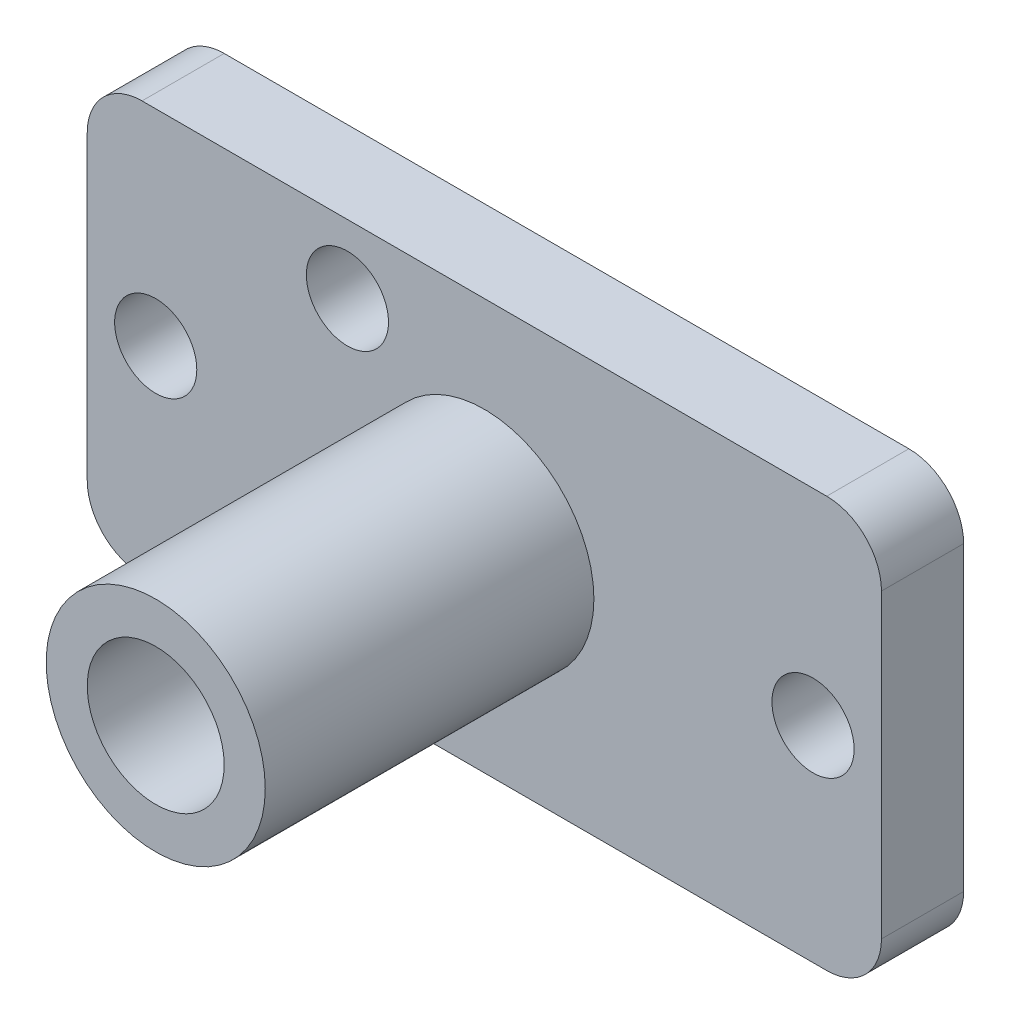
ISO-10303-21;
HEADER;
FILE_DESCRIPTION(('STEP AP214'),'2;1');
FILE_NAME('part.step','',(''),(''),'','','');
FILE_SCHEMA(('AUTOMOTIVE_DESIGN { 1 0 10303 214 1 1 1 1 }'));
ENDSEC;
DATA;
#1=APPLICATION_CONTEXT('core data for automotive mechanical design processes');
#2=APPLICATION_PROTOCOL_DEFINITION('international standard','automotive_design',2000,#1);
#3=PRODUCT_CONTEXT('',#1,'mechanical');
#4=PRODUCT('Part','Part','',(#3));
#5=PRODUCT_RELATED_PRODUCT_CATEGORY('part','',(#4));
#6=PRODUCT_DEFINITION_FORMATION('','',#4);
#7=PRODUCT_DEFINITION_CONTEXT('part definition',#1,'design');
#8=PRODUCT_DEFINITION('design','',#6,#7);
#9=PRODUCT_DEFINITION_SHAPE('','',#8);
#10=(LENGTH_UNIT() NAMED_UNIT(*) SI_UNIT(.MILLI.,.METRE.));
#11=(NAMED_UNIT(*) PLANE_ANGLE_UNIT() SI_UNIT($,.RADIAN.));
#12=(NAMED_UNIT(*) SI_UNIT($,.STERADIAN.) SOLID_ANGLE_UNIT());
#13=UNCERTAINTY_MEASURE_WITH_UNIT(LENGTH_MEASURE(1.E-05),#10,'distance_accuracy_value','');
#14=(GEOMETRIC_REPRESENTATION_CONTEXT(3) GLOBAL_UNCERTAINTY_ASSIGNED_CONTEXT((#13)) GLOBAL_UNIT_ASSIGNED_CONTEXT((#10,
#11,#12)) REPRESENTATION_CONTEXT('',''));
#15=CARTESIAN_POINT('',(0.,0.,0.));
#16=DIRECTION('',(0.,0.,1.));
#17=DIRECTION('',(1.,0.,0.));
#18=AXIS2_PLACEMENT_3D('',#15,#16,#17);
#19=CARTESIAN_POINT('',(0.,0.,3.));
#20=DIRECTION('',(0.,1.,0.));
#21=DIRECTION('',(0.,0.,1.));
#22=AXIS2_PLACEMENT_3D('',#19,#20,#21);
#23=PLANE('',#22);
#24=DIRECTION('',(1.,0.,0.));
#25=VECTOR('',#24,1.);
#26=CARTESIAN_POINT('',(0.,0.,0.));
#27=LINE('',#26,#25);
#28=CARTESIAN_POINT('',(2.,0.,0.));
#29=VERTEX_POINT('',#28);
#30=CARTESIAN_POINT('',(27.,0.,0.));
#31=VERTEX_POINT('',#30);
#32=EDGE_CURVE('E210',#29,#31,#27,.T.);
#33=ORIENTED_EDGE('',*,*,#32,.T.);
#34=DIRECTION('',(0.,0.,-1.));
#35=VECTOR('',#34,1.);
#36=CARTESIAN_POINT('',(27.,0.,3.));
#37=LINE('',#36,#35);
#38=CARTESIAN_POINT('',(27.,0.,3.));
#39=VERTEX_POINT('',#38);
#40=EDGE_CURVE('E180',#31,#39,#37,.F.);
#41=ORIENTED_EDGE('',*,*,#40,.T.);
#42=DIRECTION('',(1.,0.,0.));
#43=VECTOR('',#42,1.);
#44=CARTESIAN_POINT('',(0.,0.,3.));
#45=LINE('',#44,#43);
#46=CARTESIAN_POINT('',(2.,0.,3.));
#47=VERTEX_POINT('',#46);
#48=EDGE_CURVE('E230',#47,#39,#45,.T.);
#49=ORIENTED_EDGE('',*,*,#48,.F.);
#50=DIRECTION('',(0.,0.,-1.));
#51=VECTOR('',#50,1.);
#52=CARTESIAN_POINT('',(2.,0.,0.));
#53=LINE('',#52,#51);
#54=EDGE_CURVE('E176',#47,#29,#53,.T.);
#55=ORIENTED_EDGE('',*,*,#54,.T.);
#56=EDGE_LOOP('',(#33,#41,#49,#55));
#57=FACE_BOUND('',#56,.T.);
#58=ADVANCED_FACE('F51',(#57),#23,.F.);
#59=CARTESIAN_POINT('',(29.,0.,3.));
#60=DIRECTION('',(-1.,0.,0.));
#61=DIRECTION('',(0.,-1.,0.));
#62=AXIS2_PLACEMENT_3D('',#59,#60,#61);
#63=PLANE('',#62);
#64=DIRECTION('',(0.,1.,0.));
#65=VECTOR('',#64,1.);
#66=CARTESIAN_POINT('',(29.,0.,0.));
#67=LINE('',#66,#65);
#68=CARTESIAN_POINT('',(29.,2.,0.));
#69=VERTEX_POINT('',#68);
#70=CARTESIAN_POINT('',(29.,13.,0.));
#71=VERTEX_POINT('',#70);
#72=EDGE_CURVE('E137',#69,#71,#67,.T.);
#73=ORIENTED_EDGE('',*,*,#72,.T.);
#74=DIRECTION('',(0.,0.,-1.));
#75=VECTOR('',#74,1.);
#76=CARTESIAN_POINT('',(29.,13.,3.));
#77=LINE('',#76,#75);
#78=CARTESIAN_POINT('',(29.,13.,3.));
#79=VERTEX_POINT('',#78);
#80=EDGE_CURVE('E162',#71,#79,#77,.F.);
#81=ORIENTED_EDGE('',*,*,#80,.T.);
#82=DIRECTION('',(0.,1.,0.));
#83=VECTOR('',#82,1.);
#84=CARTESIAN_POINT('',(29.,0.,3.));
#85=LINE('',#84,#83);
#86=CARTESIAN_POINT('',(29.,2.,3.));
#87=VERTEX_POINT('',#86);
#88=EDGE_CURVE('E189',#87,#79,#85,.T.);
#89=ORIENTED_EDGE('',*,*,#88,.F.);
#90=DIRECTION('',(0.,0.,-1.));
#91=VECTOR('',#90,1.);
#92=CARTESIAN_POINT('',(29.,2.,3.));
#93=LINE('',#92,#91);
#94=EDGE_CURVE('E158',#87,#69,#93,.T.);
#95=ORIENTED_EDGE('',*,*,#94,.T.);
#96=EDGE_LOOP('',(#73,#81,#89,#95));
#97=FACE_BOUND('',#96,.T.);
#98=ADVANCED_FACE('F219',(#97),#63,.F.);
#99=CARTESIAN_POINT('',(0.,15.,3.));
#100=DIRECTION('',(0.,1.,0.));
#101=DIRECTION('',(0.,0.,1.));
#102=AXIS2_PLACEMENT_3D('',#99,#100,#101);
#103=PLANE('',#102);
#104=DIRECTION('',(1.,0.,0.));
#105=VECTOR('',#104,1.);
#106=CARTESIAN_POINT('',(0.,15.,3.));
#107=LINE('',#106,#105);
#108=CARTESIAN_POINT('',(2.,15.,3.));
#109=VERTEX_POINT('',#108);
#110=CARTESIAN_POINT('',(27.,15.,3.));
#111=VERTEX_POINT('',#110);
#112=EDGE_CURVE('E186',#109,#111,#107,.T.);
#113=ORIENTED_EDGE('',*,*,#112,.T.);
#114=DIRECTION('',(0.,0.,-1.));
#115=VECTOR('',#114,1.);
#116=CARTESIAN_POINT('',(27.,15.,0.));
#117=LINE('',#116,#115);
#118=CARTESIAN_POINT('',(27.,15.,0.));
#119=VERTEX_POINT('',#118);
#120=EDGE_CURVE('E128',#111,#119,#117,.T.);
#121=ORIENTED_EDGE('',*,*,#120,.T.);
#122=DIRECTION('',(1.,0.,0.));
#123=VECTOR('',#122,1.);
#124=CARTESIAN_POINT('',(0.,15.,0.));
#125=LINE('',#124,#123);
#126=CARTESIAN_POINT('',(2.,15.,0.));
#127=VERTEX_POINT('',#126);
#128=EDGE_CURVE('E120',#127,#119,#125,.T.);
#129=ORIENTED_EDGE('',*,*,#128,.F.);
#130=DIRECTION('',(0.,0.,-1.));
#131=VECTOR('',#130,1.);
#132=CARTESIAN_POINT('',(2.,15.,3.));
#133=LINE('',#132,#131);
#134=EDGE_CURVE('E134',#127,#109,#133,.F.);
#135=ORIENTED_EDGE('',*,*,#134,.T.);
#136=EDGE_LOOP('',(#113,#121,#129,#135));
#137=FACE_BOUND('',#136,.T.);
#138=ADVANCED_FACE('F133',(#137),#103,.T.);
#139=CARTESIAN_POINT('',(2.5,7.5,3.));
#140=DIRECTION('',(0.,0.,-1.));
#141=DIRECTION('',(-1.,0.,0.));
#142=AXIS2_PLACEMENT_3D('',#139,#140,#141);
#143=CYLINDRICAL_SURFACE('',#142,1.5);
#144=CARTESIAN_POINT('',(2.5,7.5,3.));
#145=DIRECTION('',(0.,0.,1.));
#146=DIRECTION('',(1.,0.,0.));
#147=AXIS2_PLACEMENT_3D('',#144,#145,#146);
#148=CIRCLE('',#147,1.5);
#149=CARTESIAN_POINT('',(4.,7.5,3.));
#150=VERTEX_POINT('',#149);
#151=EDGE_CURVE('E232',#150,#150,#148,.T.);
#152=ORIENTED_EDGE('',*,*,#151,.T.);
#153=EDGE_LOOP('',(#152));
#154=FACE_BOUND('',#153,.T.);
#155=CARTESIAN_POINT('',(2.5,7.5,0.));
#156=DIRECTION('',(0.,0.,1.));
#157=DIRECTION('',(1.,0.,0.));
#158=AXIS2_PLACEMENT_3D('',#155,#156,#157);
#159=CIRCLE('',#158,1.5);
#160=CARTESIAN_POINT('',(4.,7.5,0.));
#161=VERTEX_POINT('',#160);
#162=EDGE_CURVE('E206',#161,#161,#159,.T.);
#163=ORIENTED_EDGE('',*,*,#162,.F.);
#164=EDGE_LOOP('',(#163));
#165=FACE_BOUND('',#164,.T.);
#166=ADVANCED_FACE('F287',(#154,#165),#143,.F.);
#167=CARTESIAN_POINT('',(26.5,7.5,3.));
#168=DIRECTION('',(0.,0.,-1.));
#169=DIRECTION('',(-1.,0.,0.));
#170=AXIS2_PLACEMENT_3D('',#167,#168,#169);
#171=CYLINDRICAL_SURFACE('',#170,1.5);
#172=CARTESIAN_POINT('',(26.5,7.5,3.));
#173=DIRECTION('',(0.,0.,1.));
#174=DIRECTION('',(1.,0.,0.));
#175=AXIS2_PLACEMENT_3D('',#172,#173,#174);
#176=CIRCLE('',#175,1.5);
#177=CARTESIAN_POINT('',(28.,7.5,3.));
#178=VERTEX_POINT('',#177);
#179=EDGE_CURVE('E238',#178,#178,#176,.T.);
#180=ORIENTED_EDGE('',*,*,#179,.T.);
#181=EDGE_LOOP('',(#180));
#182=FACE_BOUND('',#181,.T.);
#183=CARTESIAN_POINT('',(26.5,7.5,0.));
#184=DIRECTION('',(0.,0.,1.));
#185=DIRECTION('',(1.,0.,0.));
#186=AXIS2_PLACEMENT_3D('',#183,#184,#185);
#187=CIRCLE('',#186,1.5);
#188=CARTESIAN_POINT('',(28.,7.5,0.));
#189=VERTEX_POINT('',#188);
#190=EDGE_CURVE('E202',#189,#189,#187,.T.);
#191=ORIENTED_EDGE('',*,*,#190,.F.);
#192=EDGE_LOOP('',(#191));
#193=FACE_BOUND('',#192,.T.);
#194=ADVANCED_FACE('F290',(#182,#193),#171,.F.);
#195=CARTESIAN_POINT('',(9.5,12.5,3.));
#196=DIRECTION('',(0.,0.,-1.));
#197=DIRECTION('',(-1.,0.,0.));
#198=AXIS2_PLACEMENT_3D('',#195,#196,#197);
#199=CYLINDRICAL_SURFACE('',#198,1.5);
#200=CARTESIAN_POINT('',(9.5,12.5,3.));
#201=DIRECTION('',(0.,0.,1.));
#202=DIRECTION('',(1.,0.,0.));
#203=AXIS2_PLACEMENT_3D('',#200,#201,#202);
#204=CIRCLE('',#203,1.5);
#205=CARTESIAN_POINT('',(11.,12.5,3.));
#206=VERTEX_POINT('',#205);
#207=EDGE_CURVE('E242',#206,#206,#204,.T.);
#208=ORIENTED_EDGE('',*,*,#207,.T.);
#209=EDGE_LOOP('',(#208));
#210=FACE_BOUND('',#209,.T.);
#211=CARTESIAN_POINT('',(9.5,12.5,0.));
#212=DIRECTION('',(0.,0.,1.));
#213=DIRECTION('',(1.,0.,0.));
#214=AXIS2_PLACEMENT_3D('',#211,#212,#213);
#215=CIRCLE('',#214,1.5);
#216=CARTESIAN_POINT('',(11.,12.5,0.));
#217=VERTEX_POINT('',#216);
#218=EDGE_CURVE('E197',#217,#217,#215,.T.);
#219=ORIENTED_EDGE('',*,*,#218,.F.);
#220=EDGE_LOOP('',(#219));
#221=FACE_BOUND('',#220,.T.);
#222=ADVANCED_FACE('F294',(#210,#221),#199,.F.);
#223=CARTESIAN_POINT('',(9.5,2.5,3.));
#224=DIRECTION('',(0.,0.,-1.));
#225=DIRECTION('',(-1.,0.,0.));
#226=AXIS2_PLACEMENT_3D('',#223,#224,#225);
#227=CYLINDRICAL_SURFACE('',#226,1.5);
#228=CARTESIAN_POINT('',(9.5,2.5,3.));
#229=DIRECTION('',(0.,0.,1.));
#230=DIRECTION('',(1.,0.,0.));
#231=AXIS2_PLACEMENT_3D('',#228,#229,#230);
#232=CIRCLE('',#231,1.5);
#233=CARTESIAN_POINT('',(11.,2.5,3.));
#234=VERTEX_POINT('',#233);
#235=EDGE_CURVE('E246',#234,#234,#232,.T.);
#236=ORIENTED_EDGE('',*,*,#235,.T.);
#237=EDGE_LOOP('',(#236));
#238=FACE_BOUND('',#237,.T.);
#239=CARTESIAN_POINT('',(9.5,2.5,0.));
#240=DIRECTION('',(0.,0.,1.));
#241=DIRECTION('',(1.,0.,0.));
#242=AXIS2_PLACEMENT_3D('',#239,#240,#241);
#243=CIRCLE('',#242,1.5);
#244=CARTESIAN_POINT('',(11.,2.5,0.));
#245=VERTEX_POINT('',#244);
#246=EDGE_CURVE('E193',#245,#245,#243,.T.);
#247=ORIENTED_EDGE('',*,*,#246,.F.);
#248=EDGE_LOOP('',(#247));
#249=FACE_BOUND('',#248,.T.);
#250=ADVANCED_FACE('F298',(#238,#249),#227,.F.);
#251=CARTESIAN_POINT('',(0.,0.,3.));
#252=DIRECTION('',(-1.,0.,0.));
#253=DIRECTION('',(0.,0.,1.));
#254=AXIS2_PLACEMENT_3D('',#251,#252,#253);
#255=PLANE('',#254);
#256=DIRECTION('',(0.,1.,0.));
#257=VECTOR('',#256,1.);
#258=CARTESIAN_POINT('',(0.,0.,0.));
#259=LINE('',#258,#257);
#260=CARTESIAN_POINT('',(0.,2.,0.));
#261=VERTEX_POINT('',#260);
#262=CARTESIAN_POINT('',(0.,13.,0.));
#263=VERTEX_POINT('',#262);
#264=EDGE_CURVE('E121',#261,#263,#259,.T.);
#265=ORIENTED_EDGE('',*,*,#264,.F.);
#266=DIRECTION('',(0.,0.,-1.));
#267=VECTOR('',#266,1.);
#268=CARTESIAN_POINT('',(0.,2.,3.));
#269=LINE('',#268,#267);
#270=CARTESIAN_POINT('',(0.,2.,3.));
#271=VERTEX_POINT('',#270);
#272=EDGE_CURVE('E12',#261,#271,#269,.F.);
#273=ORIENTED_EDGE('',*,*,#272,.T.);
#274=DIRECTION('',(0.,1.,0.));
#275=VECTOR('',#274,1.);
#276=CARTESIAN_POINT('',(0.,0.,3.));
#277=LINE('',#276,#275);
#278=CARTESIAN_POINT('',(0.,13.,3.));
#279=VERTEX_POINT('',#278);
#280=EDGE_CURVE('E146',#271,#279,#277,.T.);
#281=ORIENTED_EDGE('',*,*,#280,.T.);
#282=DIRECTION('',(0.,0.,-1.));
#283=VECTOR('',#282,1.);
#284=CARTESIAN_POINT('',(0.,13.,3.));
#285=LINE('',#284,#283);
#286=EDGE_CURVE('E60',#279,#263,#285,.T.);
#287=ORIENTED_EDGE('',*,*,#286,.T.);
#288=EDGE_LOOP('',(#265,#273,#281,#287));
#289=FACE_BOUND('',#288,.T.);
#290=ADVANCED_FACE('F183',(#289),#255,.T.);
#291=CARTESIAN_POINT('',(0.,0.,3.));
#292=DIRECTION('',(0.,0.,1.));
#293=DIRECTION('',(1.,0.,0.));
#294=AXIS2_PLACEMENT_3D('',#291,#292,#293);
#295=PLANE('',#294);
#296=CARTESIAN_POINT('',(14.5,7.5,3.));
#297=DIRECTION('',(0.,0.,1.));
#298=DIRECTION('',(1.,0.,0.));
#299=AXIS2_PLACEMENT_3D('',#296,#297,#298);
#300=CIRCLE('',#299,4.);
#301=CARTESIAN_POINT('',(18.5,7.5,3.));
#302=VERTEX_POINT('',#301);
#303=EDGE_CURVE('E198',#302,#302,#300,.F.);
#304=ORIENTED_EDGE('',*,*,#303,.T.);
#305=EDGE_LOOP('',(#304));
#306=FACE_BOUND('',#305,.T.);
#307=ORIENTED_EDGE('',*,*,#235,.F.);
#308=EDGE_LOOP('',(#307));
#309=FACE_BOUND('',#308,.T.);
#310=ORIENTED_EDGE('',*,*,#207,.F.);
#311=EDGE_LOOP('',(#310));
#312=FACE_BOUND('',#311,.T.);
#313=ORIENTED_EDGE('',*,*,#179,.F.);
#314=EDGE_LOOP('',(#313));
#315=FACE_BOUND('',#314,.T.);
#316=ORIENTED_EDGE('',*,*,#151,.F.);
#317=EDGE_LOOP('',(#316));
#318=FACE_BOUND('',#317,.T.);
#319=ORIENTED_EDGE('',*,*,#88,.T.);
#320=CARTESIAN_POINT('',(27.,13.,3.));
#321=DIRECTION('',(0.,0.,1.));
#322=DIRECTION('',(1.,0.,0.));
#323=AXIS2_PLACEMENT_3D('',#320,#321,#322);
#324=CIRCLE('',#323,2.);
#325=EDGE_CURVE('E173',#79,#111,#324,.T.);
#326=ORIENTED_EDGE('',*,*,#325,.T.);
#327=ORIENTED_EDGE('',*,*,#112,.F.);
#328=CARTESIAN_POINT('',(2.,13.,3.));
#329=DIRECTION('',(0.,0.,1.));
#330=DIRECTION('',(1.,0.,0.));
#331=AXIS2_PLACEMENT_3D('',#328,#329,#330);
#332=CIRCLE('',#331,2.);
#333=EDGE_CURVE('E67',#109,#279,#332,.T.);
#334=ORIENTED_EDGE('',*,*,#333,.T.);
#335=ORIENTED_EDGE('',*,*,#280,.F.);
#336=CARTESIAN_POINT('',(2.,2.,3.));
#337=DIRECTION('',(0.,0.,1.));
#338=DIRECTION('',(1.,0.,0.));
#339=AXIS2_PLACEMENT_3D('',#336,#337,#338);
#340=CIRCLE('',#339,2.);
#341=EDGE_CURVE('E167',#271,#47,#340,.T.);
#342=ORIENTED_EDGE('',*,*,#341,.T.);
#343=ORIENTED_EDGE('',*,*,#48,.T.);
#344=CARTESIAN_POINT('',(27.,2.,3.));
#345=DIRECTION('',(0.,0.,1.));
#346=DIRECTION('',(1.,0.,0.));
#347=AXIS2_PLACEMENT_3D('',#344,#345,#346);
#348=CIRCLE('',#347,2.);
#349=EDGE_CURVE('E170',#39,#87,#348,.T.);
#350=ORIENTED_EDGE('',*,*,#349,.T.);
#351=EDGE_LOOP('',(#319,#326,#327,#334,#335,#342,#343,#350));
#352=FACE_BOUND('',#351,.T.);
#353=ADVANCED_FACE('F226',(#306,#309,#312,#315,#318,#352),#295,.T.);
#354=CARTESIAN_POINT('',(0.,0.,0.));
#355=DIRECTION('',(0.,0.,1.));
#356=DIRECTION('',(1.,0.,0.));
#357=AXIS2_PLACEMENT_3D('',#354,#355,#356);
#358=PLANE('',#357);
#359=ORIENTED_EDGE('',*,*,#246,.T.);
#360=EDGE_LOOP('',(#359));
#361=FACE_BOUND('',#360,.T.);
#362=ORIENTED_EDGE('',*,*,#218,.T.);
#363=EDGE_LOOP('',(#362));
#364=FACE_BOUND('',#363,.T.);
#365=ORIENTED_EDGE('',*,*,#190,.T.);
#366=EDGE_LOOP('',(#365));
#367=FACE_BOUND('',#366,.T.);
#368=ORIENTED_EDGE('',*,*,#162,.T.);
#369=EDGE_LOOP('',(#368));
#370=FACE_BOUND('',#369,.T.);
#371=ORIENTED_EDGE('',*,*,#128,.T.);
#372=CARTESIAN_POINT('',(27.,13.,0.));
#373=DIRECTION('',(0.,0.,1.));
#374=DIRECTION('',(1.,0.,0.));
#375=AXIS2_PLACEMENT_3D('',#372,#373,#374);
#376=CIRCLE('',#375,2.);
#377=EDGE_CURVE('E155',#119,#71,#376,.F.);
#378=ORIENTED_EDGE('',*,*,#377,.T.);
#379=ORIENTED_EDGE('',*,*,#72,.F.);
#380=CARTESIAN_POINT('',(27.,2.,0.));
#381=DIRECTION('',(0.,0.,1.));
#382=DIRECTION('',(1.,0.,0.));
#383=AXIS2_PLACEMENT_3D('',#380,#381,#382);
#384=CIRCLE('',#383,2.);
#385=EDGE_CURVE('E152',#69,#31,#384,.F.);
#386=ORIENTED_EDGE('',*,*,#385,.T.);
#387=ORIENTED_EDGE('',*,*,#32,.F.);
#388=CARTESIAN_POINT('',(2.,2.,0.));
#389=DIRECTION('',(0.,0.,1.));
#390=DIRECTION('',(1.,0.,0.));
#391=AXIS2_PLACEMENT_3D('',#388,#389,#390);
#392=CIRCLE('',#391,2.);
#393=EDGE_CURVE('E127',#29,#261,#392,.F.);
#394=ORIENTED_EDGE('',*,*,#393,.T.);
#395=ORIENTED_EDGE('',*,*,#264,.T.);
#396=CARTESIAN_POINT('',(2.,13.,0.));
#397=DIRECTION('',(0.,0.,1.));
#398=DIRECTION('',(1.,0.,0.));
#399=AXIS2_PLACEMENT_3D('',#396,#397,#398);
#400=CIRCLE('',#399,2.);
#401=EDGE_CURVE('E117',#263,#127,#400,.F.);
#402=ORIENTED_EDGE('',*,*,#401,.T.);
#403=EDGE_LOOP('',(#371,#378,#379,#386,#387,#394,#395,#402));
#404=FACE_BOUND('',#403,.T.);
#405=ADVANCED_FACE('F119',(#361,#364,#367,#370,#404),#358,.F.);
#406=CARTESIAN_POINT('',(14.5,7.5,15.));
#407=DIRECTION('',(0.,0.,1.));
#408=DIRECTION('',(1.,0.,0.));
#409=AXIS2_PLACEMENT_3D('',#406,#407,#408);
#410=PLANE('',#409);
#411=CARTESIAN_POINT('',(14.5,7.5,15.));
#412=DIRECTION('',(0.,0.,1.));
#413=DIRECTION('',(1.,0.,0.));
#414=AXIS2_PLACEMENT_3D('',#411,#412,#413);
#415=CIRCLE('',#414,4.);
#416=CARTESIAN_POINT('',(18.5,7.5,15.));
#417=VERTEX_POINT('',#416);
#418=EDGE_CURVE('E252',#417,#417,#415,.T.);
#419=ORIENTED_EDGE('',*,*,#418,.T.);
#420=EDGE_LOOP('',(#419));
#421=FACE_BOUND('',#420,.T.);
#422=CARTESIAN_POINT('',(14.5,7.5,15.));
#423=DIRECTION('',(0.,0.,1.));
#424=DIRECTION('',(1.,0.,0.));
#425=AXIS2_PLACEMENT_3D('',#422,#423,#424);
#426=CIRCLE('',#425,2.5);
#427=CARTESIAN_POINT('',(17.,7.5,15.));
#428=VERTEX_POINT('',#427);
#429=EDGE_CURVE('E257',#428,#428,#426,.T.);
#430=ORIENTED_EDGE('',*,*,#429,.F.);
#431=EDGE_LOOP('',(#430));
#432=FACE_BOUND('',#431,.T.);
#433=ADVANCED_FACE('F264',(#421,#432),#410,.T.);
#434=CARTESIAN_POINT('',(14.5,7.5,15.));
#435=DIRECTION('',(0.,0.,-1.));
#436=DIRECTION('',(-1.,0.,0.));
#437=AXIS2_PLACEMENT_3D('',#434,#435,#436);
#438=CYLINDRICAL_SURFACE('',#437,4.);
#439=ORIENTED_EDGE('',*,*,#303,.F.);
#440=EDGE_LOOP('',(#439));
#441=FACE_BOUND('',#440,.T.);
#442=ORIENTED_EDGE('',*,*,#418,.F.);
#443=EDGE_LOOP('',(#442));
#444=FACE_BOUND('',#443,.T.);
#445=ADVANCED_FACE('F266',(#441,#444),#438,.T.);
#446=CARTESIAN_POINT('',(14.5,7.5,15.));
#447=DIRECTION('',(0.,0.,-1.));
#448=DIRECTION('',(-1.,0.,0.));
#449=AXIS2_PLACEMENT_3D('',#446,#447,#448);
#450=CYLINDRICAL_SURFACE('',#449,2.5);
#451=CARTESIAN_POINT('',(14.5,7.5,3.));
#452=DIRECTION('',(0.,0.,1.));
#453=DIRECTION('',(1.,0.,0.));
#454=AXIS2_PLACEMENT_3D('',#451,#452,#453);
#455=CIRCLE('',#454,2.5);
#456=CARTESIAN_POINT('',(17.,7.5,3.));
#457=VERTEX_POINT('',#456);
#458=EDGE_CURVE('E140',#457,#457,#455,.F.);
#459=ORIENTED_EDGE('',*,*,#458,.T.);
#460=EDGE_LOOP('',(#459));
#461=FACE_BOUND('',#460,.T.);
#462=ORIENTED_EDGE('',*,*,#429,.T.);
#463=EDGE_LOOP('',(#462));
#464=FACE_BOUND('',#463,.T.);
#465=ADVANCED_FACE('F262',(#461,#464),#450,.F.);
#466=ORIENTED_EDGE('',*,*,#458,.F.);
#467=EDGE_LOOP('',(#466));
#468=FACE_BOUND('',#467,.T.);
#469=ADVANCED_FACE('F306',(#468),#295,.T.);
#470=CARTESIAN_POINT('',(27.,13.,3.));
#471=DIRECTION('',(0.,0.,1.));
#472=DIRECTION('',(1.,0.,0.));
#473=AXIS2_PLACEMENT_3D('',#470,#471,#472);
#474=CYLINDRICAL_SURFACE('',#473,2.);
#475=ORIENTED_EDGE('',*,*,#325,.F.);
#476=ORIENTED_EDGE('',*,*,#80,.F.);
#477=ORIENTED_EDGE('',*,*,#377,.F.);
#478=ORIENTED_EDGE('',*,*,#120,.F.);
#479=EDGE_LOOP('',(#475,#476,#477,#478));
#480=FACE_BOUND('',#479,.T.);
#481=ADVANCED_FACE('F225',(#480),#474,.T.);
#482=CARTESIAN_POINT('',(27.,2.,3.));
#483=DIRECTION('',(0.,0.,-1.));
#484=DIRECTION('',(-1.,0.,0.));
#485=AXIS2_PLACEMENT_3D('',#482,#483,#484);
#486=CYLINDRICAL_SURFACE('',#485,2.);
#487=ORIENTED_EDGE('',*,*,#349,.F.);
#488=ORIENTED_EDGE('',*,*,#40,.F.);
#489=ORIENTED_EDGE('',*,*,#385,.F.);
#490=ORIENTED_EDGE('',*,*,#94,.F.);
#491=EDGE_LOOP('',(#487,#488,#489,#490));
#492=FACE_BOUND('',#491,.T.);
#493=ADVANCED_FACE('F305',(#492),#486,.T.);
#494=CARTESIAN_POINT('',(2.,2.,3.));
#495=DIRECTION('',(0.,0.,1.));
#496=DIRECTION('',(1.,0.,0.));
#497=AXIS2_PLACEMENT_3D('',#494,#495,#496);
#498=CYLINDRICAL_SURFACE('',#497,2.);
#499=ORIENTED_EDGE('',*,*,#341,.F.);
#500=ORIENTED_EDGE('',*,*,#272,.F.);
#501=ORIENTED_EDGE('',*,*,#393,.F.);
#502=ORIENTED_EDGE('',*,*,#54,.F.);
#503=EDGE_LOOP('',(#499,#500,#501,#502));
#504=FACE_BOUND('',#503,.T.);
#505=ADVANCED_FACE('F308',(#504),#498,.T.);
#506=CARTESIAN_POINT('',(2.,13.,3.));
#507=DIRECTION('',(0.,0.,-1.));
#508=DIRECTION('',(-1.,0.,0.));
#509=AXIS2_PLACEMENT_3D('',#506,#507,#508);
#510=CYLINDRICAL_SURFACE('',#509,2.);
#511=ORIENTED_EDGE('',*,*,#333,.F.);
#512=ORIENTED_EDGE('',*,*,#134,.F.);
#513=ORIENTED_EDGE('',*,*,#401,.F.);
#514=ORIENTED_EDGE('',*,*,#286,.F.);
#515=EDGE_LOOP('',(#511,#512,#513,#514));
#516=FACE_BOUND('',#515,.T.);
#517=ADVANCED_FACE('F53',(#516),#510,.T.);
#518=CLOSED_SHELL('',(#58,#98,#138,#166,#194,#222,#250,#290,#353,#405,#433,#445,#465,#469,#481,
#493,#505,#517));
#519=MANIFOLD_SOLID_BREP('B2',#518);
#520=ADVANCED_BREP_SHAPE_REPRESENTATION('',(#18,#519),#14);
#521=SHAPE_DEFINITION_REPRESENTATION(#9,#520);
ENDSEC;
END-ISO-10303-21;
